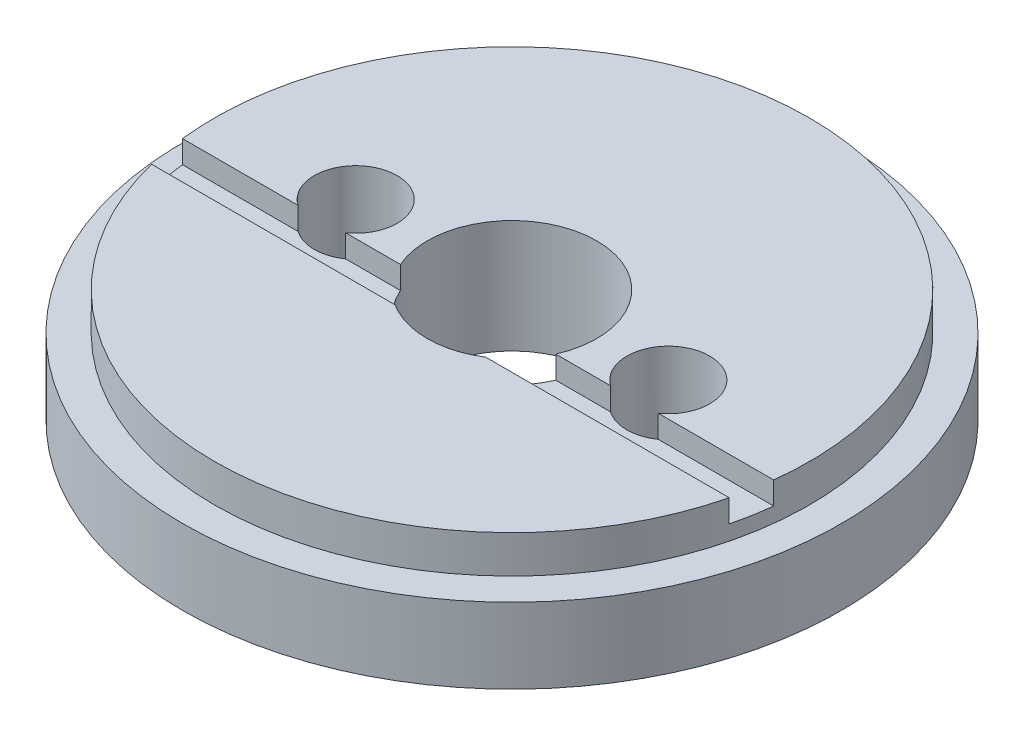
ISO-10303-21;
HEADER;
FILE_DESCRIPTION(('STEP AP214'),'2;1');
FILE_NAME('part.step','',(''),(''),'','','');
FILE_SCHEMA(('AUTOMOTIVE_DESIGN { 1 0 10303 214 1 1 1 1 }'));
ENDSEC;
DATA;
#1=APPLICATION_CONTEXT('core data for automotive mechanical design processes');
#2=APPLICATION_PROTOCOL_DEFINITION('international standard','automotive_design',2000,#1);
#3=PRODUCT_CONTEXT('',#1,'mechanical');
#4=PRODUCT('Part','Part','',(#3));
#5=PRODUCT_RELATED_PRODUCT_CATEGORY('part','',(#4));
#6=PRODUCT_DEFINITION_FORMATION('','',#4);
#7=PRODUCT_DEFINITION_CONTEXT('part definition',#1,'design');
#8=PRODUCT_DEFINITION('design','',#6,#7);
#9=PRODUCT_DEFINITION_SHAPE('','',#8);
#10=(LENGTH_UNIT() NAMED_UNIT(*) SI_UNIT(.MILLI.,.METRE.));
#11=(NAMED_UNIT(*) PLANE_ANGLE_UNIT() SI_UNIT($,.RADIAN.));
#12=(NAMED_UNIT(*) SI_UNIT($,.STERADIAN.) SOLID_ANGLE_UNIT());
#13=UNCERTAINTY_MEASURE_WITH_UNIT(LENGTH_MEASURE(1.E-05),#10,'distance_accuracy_value','');
#14=(GEOMETRIC_REPRESENTATION_CONTEXT(3) GLOBAL_UNCERTAINTY_ASSIGNED_CONTEXT((#13)) GLOBAL_UNIT_ASSIGNED_CONTEXT((#10,
#11,#12)) REPRESENTATION_CONTEXT('',''));
#15=CARTESIAN_POINT('',(0.,0.,0.));
#16=DIRECTION('',(0.,0.,1.));
#17=DIRECTION('',(1.,0.,0.));
#18=AXIS2_PLACEMENT_3D('',#15,#16,#17);
#19=CARTESIAN_POINT('',(0.,6.,0.));
#20=DIRECTION('',(0.,1.,0.));
#21=DIRECTION('',(0.,0.,1.));
#22=AXIS2_PLACEMENT_3D('',#19,#20,#21);
#23=PLANE('',#22);
#24=CARTESIAN_POINT('',(0.,6.,0.));
#25=DIRECTION('',(0.,1.,0.));
#26=DIRECTION('',(0.,0.,1.));
#27=AXIS2_PLACEMENT_3D('',#24,#25,#26);
#28=CIRCLE('',#27,15.8);
#29=CARTESIAN_POINT('',(15.6971334962789,6.,1.8));
#30=VERTEX_POINT('',#29);
#31=CARTESIAN_POINT('',(-15.6971334962789,6.,1.8));
#32=VERTEX_POINT('',#31);
#33=EDGE_CURVE('E205',#30,#32,#28,.T.);
#34=ORIENTED_EDGE('',*,*,#33,.T.);
#35=DIRECTION('',(1.,0.,0.));
#36=VECTOR('',#35,1.);
#37=CARTESIAN_POINT('',(0.,6.,1.8));
#38=LINE('',#37,#36);
#39=CARTESIAN_POINT('',(-9.56491106406735,6.,1.8));
#40=VERTEX_POINT('',#39);
#41=EDGE_CURVE('E155',#32,#40,#38,.T.);
#42=ORIENTED_EDGE('',*,*,#41,.T.);
#43=CARTESIAN_POINT('',(-8.3,6.,0.));
#44=DIRECTION('',(0.,1.,0.));
#45=DIRECTION('',(0.,0.,1.));
#46=AXIS2_PLACEMENT_3D('',#43,#44,#45);
#47=CIRCLE('',#46,2.2);
#48=CARTESIAN_POINT('',(-7.03508893593265,6.,1.8));
#49=VERTEX_POINT('',#48);
#50=EDGE_CURVE('E215',#49,#40,#47,.T.);
#51=ORIENTED_EDGE('',*,*,#50,.F.);
#52=CARTESIAN_POINT('',(-4.12431812546026,6.,1.8));
#53=VERTEX_POINT('',#52);
#54=EDGE_CURVE('E254',#49,#53,#38,.T.);
#55=ORIENTED_EDGE('',*,*,#54,.T.);
#56=CARTESIAN_POINT('',(0.,6.,0.));
#57=DIRECTION('',(0.,1.,0.));
#58=DIRECTION('',(0.,0.,1.));
#59=AXIS2_PLACEMENT_3D('',#56,#57,#58);
#60=CIRCLE('',#59,4.5);
#61=CARTESIAN_POINT('',(4.12431812546026,6.,1.8));
#62=VERTEX_POINT('',#61);
#63=EDGE_CURVE('E13',#62,#53,#60,.T.);
#64=ORIENTED_EDGE('',*,*,#63,.F.);
#65=DIRECTION('',(1.,0.,0.));
#66=VECTOR('',#65,1.);
#67=CARTESIAN_POINT('',(0.,6.,1.8));
#68=LINE('',#67,#66);
#69=CARTESIAN_POINT('',(7.03508893593265,6.,1.8));
#70=VERTEX_POINT('',#69);
#71=EDGE_CURVE('E172',#62,#70,#68,.T.);
#72=ORIENTED_EDGE('',*,*,#71,.T.);
#73=CARTESIAN_POINT('',(8.3,6.,0.));
#74=DIRECTION('',(0.,-1.,0.));
#75=DIRECTION('',(0.,0.,-1.));
#76=AXIS2_PLACEMENT_3D('',#73,#74,#75);
#77=CIRCLE('',#76,2.2);
#78=CARTESIAN_POINT('',(9.56491106406735,6.,1.8));
#79=VERTEX_POINT('',#78);
#80=EDGE_CURVE('E208',#70,#79,#77,.T.);
#81=ORIENTED_EDGE('',*,*,#80,.T.);
#82=EDGE_CURVE('E184',#79,#30,#68,.T.);
#83=ORIENTED_EDGE('',*,*,#82,.T.);
#84=EDGE_LOOP('',(#34,#42,#51,#55,#64,#72,#81,#83));
#85=FACE_BOUND('',#84,.T.);
#86=ADVANCED_FACE('F47',(#85),#23,.T.);
#87=DIRECTION('',(1.,0.,0.));
#88=VECTOR('',#87,1.);
#89=CARTESIAN_POINT('',(0.,6.,3.8));
#90=LINE('',#89,#88);
#91=CARTESIAN_POINT('',(-15.3362316101447,6.,3.8));
#92=VERTEX_POINT('',#91);
#93=CARTESIAN_POINT('',(-2.41039415863879,6.,3.8));
#94=VERTEX_POINT('',#93);
#95=EDGE_CURVE('E190',#92,#94,#90,.T.);
#96=ORIENTED_EDGE('',*,*,#95,.F.);
#97=CARTESIAN_POINT('',(15.3362316101447,6.,3.8));
#98=VERTEX_POINT('',#97);
#99=EDGE_CURVE('E161',#92,#98,#28,.T.);
#100=ORIENTED_EDGE('',*,*,#99,.T.);
#101=DIRECTION('',(1.,0.,0.));
#102=VECTOR('',#101,1.);
#103=CARTESIAN_POINT('',(0.,6.,3.8));
#104=LINE('',#103,#102);
#105=CARTESIAN_POINT('',(2.41039415863879,6.,3.8));
#106=VERTEX_POINT('',#105);
#107=EDGE_CURVE('E182',#106,#98,#104,.T.);
#108=ORIENTED_EDGE('',*,*,#107,.F.);
#109=EDGE_CURVE('E56',#94,#106,#60,.T.);
#110=ORIENTED_EDGE('',*,*,#109,.F.);
#111=EDGE_LOOP('',(#96,#100,#108,#110));
#112=FACE_BOUND('',#111,.T.);
#113=ADVANCED_FACE('F295',(#112),#23,.T.);
#114=CARTESIAN_POINT('',(0.,6.,0.));
#115=DIRECTION('',(0.,-1.,0.));
#116=DIRECTION('',(0.,0.,-1.));
#117=AXIS2_PLACEMENT_3D('',#114,#115,#116);
#118=CYLINDRICAL_SURFACE('',#117,4.5);
#119=CARTESIAN_POINT('',(0.,0.,0.));
#120=DIRECTION('',(0.,1.,0.));
#121=DIRECTION('',(0.,0.,1.));
#122=AXIS2_PLACEMENT_3D('',#119,#120,#121);
#123=CIRCLE('',#122,4.5);
#124=CARTESIAN_POINT('',(0.,0.,4.5));
#125=VERTEX_POINT('',#124);
#126=EDGE_CURVE('E218',#125,#125,#123,.T.);
#127=ORIENTED_EDGE('',*,*,#126,.F.);
#128=EDGE_LOOP('',(#127));
#129=FACE_BOUND('',#128,.T.);
#130=ORIENTED_EDGE('',*,*,#63,.T.);
#131=DIRECTION('',(0.,1.,0.));
#132=VECTOR('',#131,1.);
#133=CARTESIAN_POINT('',(-4.12431812546026,4.8,1.8));
#134=LINE('',#133,#132);
#135=CARTESIAN_POINT('',(-4.12431812546026,4.8,1.8));
#136=VERTEX_POINT('',#135);
#137=EDGE_CURVE('E163',#136,#53,#134,.T.);
#138=ORIENTED_EDGE('',*,*,#137,.F.);
#139=CARTESIAN_POINT('',(0.,4.8,0.));
#140=DIRECTION('',(0.,1.,0.));
#141=DIRECTION('',(0.,0.,1.));
#142=AXIS2_PLACEMENT_3D('',#139,#140,#141);
#143=CIRCLE('',#142,4.5);
#144=CARTESIAN_POINT('',(-2.41039415863879,4.8,3.8));
#145=VERTEX_POINT('',#144);
#146=EDGE_CURVE('E148',#145,#136,#143,.F.);
#147=ORIENTED_EDGE('',*,*,#146,.F.);
#148=DIRECTION('',(0.,1.,0.));
#149=VECTOR('',#148,1.);
#150=CARTESIAN_POINT('',(-2.41039415863879,4.8,3.8));
#151=LINE('',#150,#149);
#152=EDGE_CURVE('E145',#145,#94,#151,.T.);
#153=ORIENTED_EDGE('',*,*,#152,.T.);
#154=ORIENTED_EDGE('',*,*,#109,.T.);
#155=DIRECTION('',(0.,1.,0.));
#156=VECTOR('',#155,1.);
#157=CARTESIAN_POINT('',(2.41039415863879,4.8,3.8));
#158=LINE('',#157,#156);
#159=CARTESIAN_POINT('',(2.41039415863879,4.8,3.8));
#160=VERTEX_POINT('',#159);
#161=EDGE_CURVE('E200',#160,#106,#158,.T.);
#162=ORIENTED_EDGE('',*,*,#161,.F.);
#163=CARTESIAN_POINT('',(0.,4.8,0.));
#164=DIRECTION('',(0.,1.,0.));
#165=DIRECTION('',(0.,0.,1.));
#166=AXIS2_PLACEMENT_3D('',#163,#164,#165);
#167=CIRCLE('',#166,4.5);
#168=CARTESIAN_POINT('',(4.12431812546026,4.8,1.8));
#169=VERTEX_POINT('',#168);
#170=EDGE_CURVE('E170',#169,#160,#167,.F.);
#171=ORIENTED_EDGE('',*,*,#170,.F.);
#172=DIRECTION('',(0.,1.,0.));
#173=VECTOR('',#172,1.);
#174=CARTESIAN_POINT('',(4.12431812546026,4.8,1.8));
#175=LINE('',#174,#173);
#176=EDGE_CURVE('E187',#169,#62,#175,.T.);
#177=ORIENTED_EDGE('',*,*,#176,.T.);
#178=EDGE_LOOP('',(#130,#138,#147,#153,#154,#162,#171,#177));
#179=FACE_BOUND('',#178,.T.);
#180=ADVANCED_FACE('F49',(#129,#179),#118,.F.);
#181=CARTESIAN_POINT('',(-8.3,6.,0.));
#182=DIRECTION('',(0.,-1.,0.));
#183=DIRECTION('',(0.,0.,-1.));
#184=AXIS2_PLACEMENT_3D('',#181,#182,#183);
#185=CYLINDRICAL_SURFACE('',#184,2.2);
#186=CARTESIAN_POINT('',(-8.3,0.,0.));
#187=DIRECTION('',(0.,1.,0.));
#188=DIRECTION('',(0.,0.,1.));
#189=AXIS2_PLACEMENT_3D('',#186,#187,#188);
#190=CIRCLE('',#189,2.2);
#191=CARTESIAN_POINT('',(-8.3,0.,2.2));
#192=VERTEX_POINT('',#191);
#193=EDGE_CURVE('E211',#192,#192,#190,.T.);
#194=ORIENTED_EDGE('',*,*,#193,.F.);
#195=EDGE_LOOP('',(#194));
#196=FACE_BOUND('',#195,.T.);
#197=ORIENTED_EDGE('',*,*,#50,.T.);
#198=DIRECTION('',(0.,1.,0.));
#199=VECTOR('',#198,1.);
#200=CARTESIAN_POINT('',(-9.56491106406735,4.8,1.8));
#201=LINE('',#200,#199);
#202=CARTESIAN_POINT('',(-9.56491106406735,4.8,1.8));
#203=VERTEX_POINT('',#202);
#204=EDGE_CURVE('E247',#203,#40,#201,.T.);
#205=ORIENTED_EDGE('',*,*,#204,.F.);
#206=CARTESIAN_POINT('',(-8.3,4.8,0.));
#207=DIRECTION('',(0.,1.,0.));
#208=DIRECTION('',(0.,0.,1.));
#209=AXIS2_PLACEMENT_3D('',#206,#207,#208);
#210=CIRCLE('',#209,2.2);
#211=CARTESIAN_POINT('',(-7.03508893593265,4.8,1.8));
#212=VERTEX_POINT('',#211);
#213=EDGE_CURVE('E165',#212,#203,#210,.F.);
#214=ORIENTED_EDGE('',*,*,#213,.F.);
#215=DIRECTION('',(0.,1.,0.));
#216=VECTOR('',#215,1.);
#217=CARTESIAN_POINT('',(-7.03508893593265,4.8,1.8));
#218=LINE('',#217,#216);
#219=EDGE_CURVE('E248',#212,#49,#218,.T.);
#220=ORIENTED_EDGE('',*,*,#219,.T.);
#221=EDGE_LOOP('',(#197,#205,#214,#220));
#222=FACE_BOUND('',#221,.T.);
#223=ADVANCED_FACE('F238',(#196,#222),#185,.F.);
#224=CARTESIAN_POINT('',(8.3,6.,0.));
#225=DIRECTION('',(0.,-1.,0.));
#226=DIRECTION('',(0.,0.,-1.));
#227=AXIS2_PLACEMENT_3D('',#224,#225,#226);
#228=CYLINDRICAL_SURFACE('',#227,2.2);
#229=CARTESIAN_POINT('',(8.3,0.,0.));
#230=DIRECTION('',(0.,-1.,0.));
#231=DIRECTION('',(0.,0.,-1.));
#232=AXIS2_PLACEMENT_3D('',#229,#230,#231);
#233=CIRCLE('',#232,2.2);
#234=CARTESIAN_POINT('',(8.3,0.,-2.2));
#235=VERTEX_POINT('',#234);
#236=EDGE_CURVE('E212',#235,#235,#233,.T.);
#237=ORIENTED_EDGE('',*,*,#236,.T.);
#238=EDGE_LOOP('',(#237));
#239=FACE_BOUND('',#238,.T.);
#240=DIRECTION('',(0.,1.,0.));
#241=VECTOR('',#240,1.);
#242=CARTESIAN_POINT('',(7.03508893593265,4.8,1.8));
#243=LINE('',#242,#241);
#244=CARTESIAN_POINT('',(7.03508893593265,4.8,1.8));
#245=VERTEX_POINT('',#244);
#246=EDGE_CURVE('E191',#245,#70,#243,.T.);
#247=ORIENTED_EDGE('',*,*,#246,.F.);
#248=CARTESIAN_POINT('',(8.3,4.8,0.));
#249=DIRECTION('',(0.,1.,0.));
#250=DIRECTION('',(0.,0.,1.));
#251=AXIS2_PLACEMENT_3D('',#248,#249,#250);
#252=CIRCLE('',#251,2.2);
#253=CARTESIAN_POINT('',(9.56491106406735,4.8,1.8));
#254=VERTEX_POINT('',#253);
#255=EDGE_CURVE('E178',#254,#245,#252,.F.);
#256=ORIENTED_EDGE('',*,*,#255,.F.);
#257=DIRECTION('',(0.,1.,0.));
#258=VECTOR('',#257,1.);
#259=CARTESIAN_POINT('',(9.56491106406735,4.8,1.8));
#260=LINE('',#259,#258);
#261=EDGE_CURVE('E193',#254,#79,#260,.T.);
#262=ORIENTED_EDGE('',*,*,#261,.T.);
#263=ORIENTED_EDGE('',*,*,#80,.F.);
#264=EDGE_LOOP('',(#247,#256,#262,#263));
#265=FACE_BOUND('',#264,.T.);
#266=ADVANCED_FACE('F241',(#239,#265),#228,.F.);
#267=CARTESIAN_POINT('',(0.,4.,0.));
#268=DIRECTION('',(0.,1.,0.));
#269=DIRECTION('',(0.,0.,1.));
#270=AXIS2_PLACEMENT_3D('',#267,#268,#269);
#271=CYLINDRICAL_SURFACE('',#270,15.8);
#272=CARTESIAN_POINT('',(0.,4.,0.));
#273=DIRECTION('',(0.,1.,0.));
#274=DIRECTION('',(0.,0.,1.));
#275=AXIS2_PLACEMENT_3D('',#272,#273,#274);
#276=CIRCLE('',#275,15.8);
#277=CARTESIAN_POINT('',(0.,4.,15.8));
#278=VERTEX_POINT('',#277);
#279=EDGE_CURVE('E202',#278,#278,#276,.T.);
#280=ORIENTED_EDGE('',*,*,#279,.T.);
#281=EDGE_LOOP('',(#280));
#282=FACE_BOUND('',#281,.T.);
#283=CARTESIAN_POINT('',(0.,4.8,0.));
#284=DIRECTION('',(0.,1.,0.));
#285=DIRECTION('',(0.,0.,1.));
#286=AXIS2_PLACEMENT_3D('',#283,#284,#285);
#287=CIRCLE('',#286,15.8);
#288=CARTESIAN_POINT('',(-15.6971334962789,4.8,1.8));
#289=VERTEX_POINT('',#288);
#290=CARTESIAN_POINT('',(-15.3362316101447,4.8,3.8));
#291=VERTEX_POINT('',#290);
#292=EDGE_CURVE('E149',#289,#291,#287,.T.);
#293=ORIENTED_EDGE('',*,*,#292,.F.);
#294=DIRECTION('',(0.,1.,0.));
#295=VECTOR('',#294,1.);
#296=CARTESIAN_POINT('',(-15.6971334962789,4.8,1.8));
#297=LINE('',#296,#295);
#298=EDGE_CURVE('E207',#289,#32,#297,.T.);
#299=ORIENTED_EDGE('',*,*,#298,.T.);
#300=ORIENTED_EDGE('',*,*,#33,.F.);
#301=DIRECTION('',(0.,1.,0.));
#302=VECTOR('',#301,1.);
#303=CARTESIAN_POINT('',(15.6971334962789,4.8,1.8));
#304=LINE('',#303,#302);
#305=CARTESIAN_POINT('',(15.6971334962789,4.8,1.8));
#306=VERTEX_POINT('',#305);
#307=EDGE_CURVE('E196',#306,#30,#304,.T.);
#308=ORIENTED_EDGE('',*,*,#307,.F.);
#309=CARTESIAN_POINT('',(0.,4.8,0.));
#310=DIRECTION('',(0.,1.,0.));
#311=DIRECTION('',(0.,0.,1.));
#312=AXIS2_PLACEMENT_3D('',#309,#310,#311);
#313=CIRCLE('',#312,15.8);
#314=CARTESIAN_POINT('',(15.3362316101447,4.8,3.8));
#315=VERTEX_POINT('',#314);
#316=EDGE_CURVE('E174',#315,#306,#313,.T.);
#317=ORIENTED_EDGE('',*,*,#316,.F.);
#318=DIRECTION('',(0.,1.,0.));
#319=VECTOR('',#318,1.);
#320=CARTESIAN_POINT('',(15.3362316101447,4.8,3.8));
#321=LINE('',#320,#319);
#322=EDGE_CURVE('E198',#315,#98,#321,.T.);
#323=ORIENTED_EDGE('',*,*,#322,.T.);
#324=ORIENTED_EDGE('',*,*,#99,.F.);
#325=DIRECTION('',(0.,1.,0.));
#326=VECTOR('',#325,1.);
#327=CARTESIAN_POINT('',(-15.3362316101447,4.8,3.8));
#328=LINE('',#327,#326);
#329=EDGE_CURVE('E142',#291,#92,#328,.T.);
#330=ORIENTED_EDGE('',*,*,#329,.F.);
#331=EDGE_LOOP('',(#293,#299,#300,#308,#317,#323,#324,#330));
#332=FACE_BOUND('',#331,.T.);
#333=ADVANCED_FACE('F158',(#282,#332),#271,.T.);
#334=CARTESIAN_POINT('',(0.,6.,0.));
#335=DIRECTION('',(0.,-1.,0.));
#336=DIRECTION('',(0.,0.,-1.));
#337=AXIS2_PLACEMENT_3D('',#334,#335,#336);
#338=CYLINDRICAL_SURFACE('',#337,17.5);
#339=CARTESIAN_POINT('',(0.,0.,0.));
#340=DIRECTION('',(0.,1.,0.));
#341=DIRECTION('',(0.,0.,1.));
#342=AXIS2_PLACEMENT_3D('',#339,#340,#341);
#343=CIRCLE('',#342,17.5);
#344=CARTESIAN_POINT('',(0.,0.,17.5));
#345=VERTEX_POINT('',#344);
#346=EDGE_CURVE('E222',#345,#345,#343,.T.);
#347=ORIENTED_EDGE('',*,*,#346,.T.);
#348=EDGE_LOOP('',(#347));
#349=FACE_BOUND('',#348,.T.);
#350=CARTESIAN_POINT('',(0.,4.,0.));
#351=DIRECTION('',(0.,1.,0.));
#352=DIRECTION('',(0.,0.,1.));
#353=AXIS2_PLACEMENT_3D('',#350,#351,#352);
#354=CIRCLE('',#353,17.5);
#355=CARTESIAN_POINT('',(0.,4.,17.5));
#356=VERTEX_POINT('',#355);
#357=EDGE_CURVE('E51',#356,#356,#354,.T.);
#358=ORIENTED_EDGE('',*,*,#357,.F.);
#359=EDGE_LOOP('',(#358));
#360=FACE_BOUND('',#359,.T.);
#361=ADVANCED_FACE('F227',(#349,#360),#338,.T.);
#362=CARTESIAN_POINT('',(0.,0.,0.));
#363=DIRECTION('',(0.,1.,0.));
#364=DIRECTION('',(0.,0.,1.));
#365=AXIS2_PLACEMENT_3D('',#362,#363,#364);
#366=PLANE('',#365);
#367=ORIENTED_EDGE('',*,*,#236,.F.);
#368=EDGE_LOOP('',(#367));
#369=FACE_BOUND('',#368,.T.);
#370=ORIENTED_EDGE('',*,*,#126,.T.);
#371=EDGE_LOOP('',(#370));
#372=FACE_BOUND('',#371,.T.);
#373=ORIENTED_EDGE('',*,*,#346,.F.);
#374=EDGE_LOOP('',(#373));
#375=FACE_BOUND('',#374,.T.);
#376=ORIENTED_EDGE('',*,*,#193,.T.);
#377=EDGE_LOOP('',(#376));
#378=FACE_BOUND('',#377,.T.);
#379=ADVANCED_FACE('F230',(#369,#372,#375,#378),#366,.F.);
#380=CARTESIAN_POINT('',(0.,4.,0.));
#381=DIRECTION('',(0.,1.,0.));
#382=DIRECTION('',(0.,0.,1.));
#383=AXIS2_PLACEMENT_3D('',#380,#381,#382);
#384=PLANE('',#383);
#385=ORIENTED_EDGE('',*,*,#279,.F.);
#386=EDGE_LOOP('',(#385));
#387=FACE_BOUND('',#386,.T.);
#388=ORIENTED_EDGE('',*,*,#357,.T.);
#389=EDGE_LOOP('',(#388));
#390=FACE_BOUND('',#389,.T.);
#391=ADVANCED_FACE('F233',(#387,#390),#384,.T.);
#392=CARTESIAN_POINT('',(0.,4.8,1.8));
#393=DIRECTION('',(0.,0.,1.));
#394=DIRECTION('',(1.,0.,0.));
#395=AXIS2_PLACEMENT_3D('',#392,#393,#394);
#396=PLANE('',#395);
#397=ORIENTED_EDGE('',*,*,#71,.F.);
#398=ORIENTED_EDGE('',*,*,#176,.F.);
#399=DIRECTION('',(1.,0.,0.));
#400=VECTOR('',#399,1.);
#401=CARTESIAN_POINT('',(0.,4.8,1.8));
#402=LINE('',#401,#400);
#403=EDGE_CURVE('E179',#169,#245,#402,.T.);
#404=ORIENTED_EDGE('',*,*,#403,.T.);
#405=ORIENTED_EDGE('',*,*,#246,.T.);
#406=EDGE_LOOP('',(#397,#398,#404,#405));
#407=FACE_BOUND('',#406,.T.);
#408=ADVANCED_FACE('F316',(#407),#396,.T.);
#409=ORIENTED_EDGE('',*,*,#82,.F.);
#410=ORIENTED_EDGE('',*,*,#261,.F.);
#411=EDGE_CURVE('E176',#254,#306,#402,.T.);
#412=ORIENTED_EDGE('',*,*,#411,.T.);
#413=ORIENTED_EDGE('',*,*,#307,.T.);
#414=EDGE_LOOP('',(#409,#410,#412,#413));
#415=FACE_BOUND('',#414,.T.);
#416=ADVANCED_FACE('F277',(#415),#396,.T.);
#417=CARTESIAN_POINT('',(0.,4.8,3.8));
#418=DIRECTION('',(0.,0.,1.));
#419=DIRECTION('',(1.,0.,0.));
#420=AXIS2_PLACEMENT_3D('',#417,#418,#419);
#421=PLANE('',#420);
#422=ORIENTED_EDGE('',*,*,#107,.T.);
#423=ORIENTED_EDGE('',*,*,#322,.F.);
#424=DIRECTION('',(1.,0.,0.));
#425=VECTOR('',#424,1.);
#426=CARTESIAN_POINT('',(0.,4.8,3.8));
#427=LINE('',#426,#425);
#428=EDGE_CURVE('E72',#160,#315,#427,.T.);
#429=ORIENTED_EDGE('',*,*,#428,.F.);
#430=ORIENTED_EDGE('',*,*,#161,.T.);
#431=EDGE_LOOP('',(#422,#423,#429,#430));
#432=FACE_BOUND('',#431,.T.);
#433=ADVANCED_FACE('F290',(#432),#421,.F.);
#434=CARTESIAN_POINT('',(0.,4.8,0.));
#435=DIRECTION('',(0.,1.,0.));
#436=DIRECTION('',(0.,0.,1.));
#437=AXIS2_PLACEMENT_3D('',#434,#435,#436);
#438=PLANE('',#437);
#439=ORIENTED_EDGE('',*,*,#170,.T.);
#440=ORIENTED_EDGE('',*,*,#428,.T.);
#441=ORIENTED_EDGE('',*,*,#316,.T.);
#442=ORIENTED_EDGE('',*,*,#411,.F.);
#443=ORIENTED_EDGE('',*,*,#255,.T.);
#444=ORIENTED_EDGE('',*,*,#403,.F.);
#445=EDGE_LOOP('',(#439,#440,#441,#442,#443,#444));
#446=FACE_BOUND('',#445,.T.);
#447=ADVANCED_FACE('F278',(#446),#438,.T.);
#448=CARTESIAN_POINT('',(0.,4.8,1.8));
#449=DIRECTION('',(0.,0.,1.));
#450=DIRECTION('',(1.,0.,0.));
#451=AXIS2_PLACEMENT_3D('',#448,#449,#450);
#452=PLANE('',#451);
#453=ORIENTED_EDGE('',*,*,#41,.F.);
#454=ORIENTED_EDGE('',*,*,#298,.F.);
#455=DIRECTION('',(1.,0.,0.));
#456=VECTOR('',#455,1.);
#457=CARTESIAN_POINT('',(0.,4.8,1.8));
#458=LINE('',#457,#456);
#459=EDGE_CURVE('E64',#289,#203,#458,.T.);
#460=ORIENTED_EDGE('',*,*,#459,.T.);
#461=ORIENTED_EDGE('',*,*,#204,.T.);
#462=EDGE_LOOP('',(#453,#454,#460,#461));
#463=FACE_BOUND('',#462,.T.);
#464=ADVANCED_FACE('F282',(#463),#452,.T.);
#465=ORIENTED_EDGE('',*,*,#54,.F.);
#466=ORIENTED_EDGE('',*,*,#219,.F.);
#467=EDGE_CURVE('E167',#212,#136,#458,.T.);
#468=ORIENTED_EDGE('',*,*,#467,.T.);
#469=ORIENTED_EDGE('',*,*,#137,.T.);
#470=EDGE_LOOP('',(#465,#466,#468,#469));
#471=FACE_BOUND('',#470,.T.);
#472=ADVANCED_FACE('F265',(#471),#452,.T.);
#473=CARTESIAN_POINT('',(0.,4.8,3.8));
#474=DIRECTION('',(0.,0.,1.));
#475=DIRECTION('',(1.,0.,0.));
#476=AXIS2_PLACEMENT_3D('',#473,#474,#475);
#477=PLANE('',#476);
#478=ORIENTED_EDGE('',*,*,#95,.T.);
#479=ORIENTED_EDGE('',*,*,#152,.F.);
#480=DIRECTION('',(1.,0.,0.));
#481=VECTOR('',#480,1.);
#482=CARTESIAN_POINT('',(0.,4.8,3.8));
#483=LINE('',#482,#481);
#484=EDGE_CURVE('E139',#291,#145,#483,.T.);
#485=ORIENTED_EDGE('',*,*,#484,.F.);
#486=ORIENTED_EDGE('',*,*,#329,.T.);
#487=EDGE_LOOP('',(#478,#479,#485,#486));
#488=FACE_BOUND('',#487,.T.);
#489=ADVANCED_FACE('F140',(#488),#477,.F.);
#490=CARTESIAN_POINT('',(0.,4.8,0.));
#491=DIRECTION('',(0.,1.,0.));
#492=DIRECTION('',(0.,0.,1.));
#493=AXIS2_PLACEMENT_3D('',#490,#491,#492);
#494=PLANE('',#493);
#495=ORIENTED_EDGE('',*,*,#292,.T.);
#496=ORIENTED_EDGE('',*,*,#484,.T.);
#497=ORIENTED_EDGE('',*,*,#146,.T.);
#498=ORIENTED_EDGE('',*,*,#467,.F.);
#499=ORIENTED_EDGE('',*,*,#213,.T.);
#500=ORIENTED_EDGE('',*,*,#459,.F.);
#501=EDGE_LOOP('',(#495,#496,#497,#498,#499,#500));
#502=FACE_BOUND('',#501,.T.);
#503=ADVANCED_FACE('F152',(#502),#494,.T.);
#504=CLOSED_SHELL('',(#86,#113,#180,#223,#266,#333,#361,#379,#391,#408,#416,#433,#447,#464,#472,
#489,#503));
#505=MANIFOLD_SOLID_BREP('B2',#504);
#506=ADVANCED_BREP_SHAPE_REPRESENTATION('',(#18,#505),#14);
#507=SHAPE_DEFINITION_REPRESENTATION(#9,#506);
ENDSEC;
END-ISO-10303-21;
